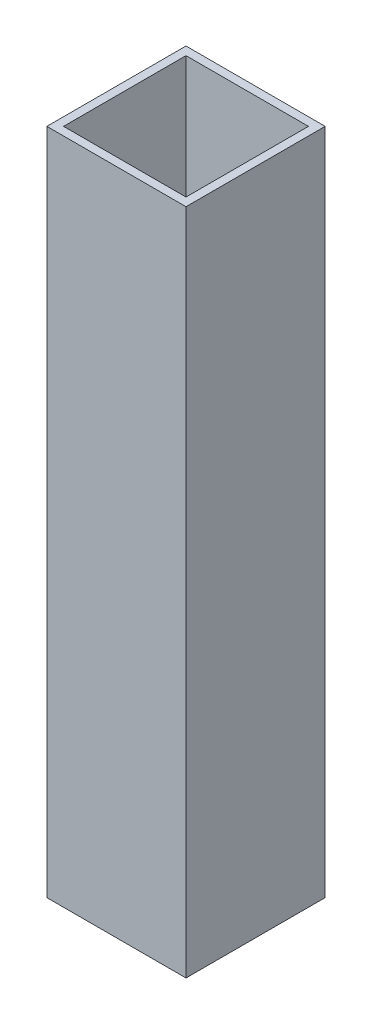
ISO-10303-21;
HEADER;
FILE_DESCRIPTION(('STEP AP214'),'2;1');
FILE_NAME('part.step','',(''),(''),'','','');
FILE_SCHEMA(('AUTOMOTIVE_DESIGN { 1 0 10303 214 1 1 1 1 }'));
ENDSEC;
DATA;
#1=APPLICATION_CONTEXT('core data for automotive mechanical design processes');
#2=APPLICATION_PROTOCOL_DEFINITION('international standard','automotive_design',2000,#1);
#3=PRODUCT_CONTEXT('',#1,'mechanical');
#4=PRODUCT('Part','Part','',(#3));
#5=PRODUCT_RELATED_PRODUCT_CATEGORY('part','',(#4));
#6=PRODUCT_DEFINITION_FORMATION('','',#4);
#7=PRODUCT_DEFINITION_CONTEXT('part definition',#1,'design');
#8=PRODUCT_DEFINITION('design','',#6,#7);
#9=PRODUCT_DEFINITION_SHAPE('','',#8);
#10=(LENGTH_UNIT() NAMED_UNIT(*) SI_UNIT(.MILLI.,.METRE.));
#11=(NAMED_UNIT(*) PLANE_ANGLE_UNIT() SI_UNIT($,.RADIAN.));
#12=(NAMED_UNIT(*) SI_UNIT($,.STERADIAN.) SOLID_ANGLE_UNIT());
#13=UNCERTAINTY_MEASURE_WITH_UNIT(LENGTH_MEASURE(1.E-05),#10,'distance_accuracy_value','');
#14=(GEOMETRIC_REPRESENTATION_CONTEXT(3) GLOBAL_UNCERTAINTY_ASSIGNED_CONTEXT((#13)) GLOBAL_UNIT_ASSIGNED_CONTEXT((#10,
#11,#12)) REPRESENTATION_CONTEXT('',''));
#15=CARTESIAN_POINT('',(0.,0.,0.));
#16=DIRECTION('',(0.,0.,1.));
#17=DIRECTION('',(1.,0.,0.));
#18=AXIS2_PLACEMENT_3D('',#15,#16,#17);
#19=CARTESIAN_POINT('',(12.5,-60.,-12.5));
#20=DIRECTION('',(1.,0.,0.));
#21=DIRECTION('',(0.,0.,-1.));
#22=AXIS2_PLACEMENT_3D('',#19,#20,#21);
#23=PLANE('',#22);
#24=DIRECTION('',(0.,1.,0.));
#25=VECTOR('',#24,1.);
#26=CARTESIAN_POINT('',(12.5,-60.,-12.5));
#27=LINE('',#26,#25);
#28=CARTESIAN_POINT('',(12.5,-60.,-12.5));
#29=VERTEX_POINT('',#28);
#30=CARTESIAN_POINT('',(12.5,60.,-12.5));
#31=VERTEX_POINT('',#30);
#32=EDGE_CURVE('E40',#29,#31,#27,.T.);
#33=ORIENTED_EDGE('',*,*,#32,.T.);
#34=DIRECTION('',(0.,0.,-1.));
#35=VECTOR('',#34,1.);
#36=CARTESIAN_POINT('',(12.5,60.,-12.5));
#37=LINE('',#36,#35);
#38=CARTESIAN_POINT('',(12.5,60.,12.5));
#39=VERTEX_POINT('',#38);
#40=EDGE_CURVE('E132',#39,#31,#37,.T.);
#41=ORIENTED_EDGE('',*,*,#40,.F.);
#42=DIRECTION('',(0.,1.,0.));
#43=VECTOR('',#42,1.);
#44=CARTESIAN_POINT('',(12.5,-60.,12.5));
#45=LINE('',#44,#43);
#46=CARTESIAN_POINT('',(12.5,-60.,12.5));
#47=VERTEX_POINT('',#46);
#48=EDGE_CURVE('E11',#47,#39,#45,.T.);
#49=ORIENTED_EDGE('',*,*,#48,.F.);
#50=DIRECTION('',(0.,0.,-1.));
#51=VECTOR('',#50,1.);
#52=CARTESIAN_POINT('',(12.5,-60.,-12.5));
#53=LINE('',#52,#51);
#54=EDGE_CURVE('E151',#47,#29,#53,.T.);
#55=ORIENTED_EDGE('',*,*,#54,.T.);
#56=EDGE_LOOP('',(#33,#41,#49,#55));
#57=FACE_BOUND('',#56,.T.);
#58=ADVANCED_FACE('F37',(#57),#23,.T.);
#59=CARTESIAN_POINT('',(-12.5,-60.,12.5));
#60=DIRECTION('',(0.,0.,1.));
#61=DIRECTION('',(1.,0.,0.));
#62=AXIS2_PLACEMENT_3D('',#59,#60,#61);
#63=PLANE('',#62);
#64=ORIENTED_EDGE('',*,*,#48,.T.);
#65=DIRECTION('',(1.,0.,0.));
#66=VECTOR('',#65,1.);
#67=CARTESIAN_POINT('',(-12.5,60.,12.5));
#68=LINE('',#67,#66);
#69=CARTESIAN_POINT('',(-12.5,60.,12.5));
#70=VERTEX_POINT('',#69);
#71=EDGE_CURVE('E141',#70,#39,#68,.T.);
#72=ORIENTED_EDGE('',*,*,#71,.F.);
#73=DIRECTION('',(0.,1.,0.));
#74=VECTOR('',#73,1.);
#75=CARTESIAN_POINT('',(-12.5,-60.,12.5));
#76=LINE('',#75,#74);
#77=CARTESIAN_POINT('',(-12.5,-60.,12.5));
#78=VERTEX_POINT('',#77);
#79=EDGE_CURVE('E45',#78,#70,#76,.T.);
#80=ORIENTED_EDGE('',*,*,#79,.F.);
#81=DIRECTION('',(1.,0.,0.));
#82=VECTOR('',#81,1.);
#83=CARTESIAN_POINT('',(-12.5,-60.,12.5));
#84=LINE('',#83,#82);
#85=EDGE_CURVE('E162',#78,#47,#84,.T.);
#86=ORIENTED_EDGE('',*,*,#85,.T.);
#87=EDGE_LOOP('',(#64,#72,#80,#86));
#88=FACE_BOUND('',#87,.T.);
#89=ADVANCED_FACE('F174',(#88),#63,.T.);
#90=CARTESIAN_POINT('',(-12.5,-60.,-12.5));
#91=DIRECTION('',(-1.,0.,0.));
#92=DIRECTION('',(0.,0.,1.));
#93=AXIS2_PLACEMENT_3D('',#90,#91,#92);
#94=PLANE('',#93);
#95=ORIENTED_EDGE('',*,*,#79,.T.);
#96=DIRECTION('',(0.,0.,1.));
#97=VECTOR('',#96,1.);
#98=CARTESIAN_POINT('',(-12.5,60.,-12.5));
#99=LINE('',#98,#97);
#100=CARTESIAN_POINT('',(-12.5,60.,-12.5));
#101=VERTEX_POINT('',#100);
#102=EDGE_CURVE('E138',#101,#70,#99,.T.);
#103=ORIENTED_EDGE('',*,*,#102,.F.);
#104=DIRECTION('',(0.,1.,0.));
#105=VECTOR('',#104,1.);
#106=CARTESIAN_POINT('',(-12.5,-60.,-12.5));
#107=LINE('',#106,#105);
#108=CARTESIAN_POINT('',(-12.5,-60.,-12.5));
#109=VERTEX_POINT('',#108);
#110=EDGE_CURVE('E165',#109,#101,#107,.T.);
#111=ORIENTED_EDGE('',*,*,#110,.F.);
#112=DIRECTION('',(0.,0.,1.));
#113=VECTOR('',#112,1.);
#114=CARTESIAN_POINT('',(-12.5,-60.,-12.5));
#115=LINE('',#114,#113);
#116=EDGE_CURVE('E159',#109,#78,#115,.T.);
#117=ORIENTED_EDGE('',*,*,#116,.T.);
#118=EDGE_LOOP('',(#95,#103,#111,#117));
#119=FACE_BOUND('',#118,.T.);
#120=ADVANCED_FACE('F180',(#119),#94,.T.);
#121=CARTESIAN_POINT('',(-12.5,-60.,-12.5));
#122=DIRECTION('',(0.,0.,-1.));
#123=DIRECTION('',(-1.,0.,0.));
#124=AXIS2_PLACEMENT_3D('',#121,#122,#123);
#125=PLANE('',#124);
#126=ORIENTED_EDGE('',*,*,#110,.T.);
#127=DIRECTION('',(-1.,0.,0.));
#128=VECTOR('',#127,1.);
#129=CARTESIAN_POINT('',(-12.5,60.,-12.5));
#130=LINE('',#129,#128);
#131=EDGE_CURVE('E135',#31,#101,#130,.T.);
#132=ORIENTED_EDGE('',*,*,#131,.F.);
#133=ORIENTED_EDGE('',*,*,#32,.F.);
#134=DIRECTION('',(-1.,0.,0.));
#135=VECTOR('',#134,1.);
#136=CARTESIAN_POINT('',(-12.5,-60.,-12.5));
#137=LINE('',#136,#135);
#138=EDGE_CURVE('E156',#29,#109,#137,.T.);
#139=ORIENTED_EDGE('',*,*,#138,.T.);
#140=EDGE_LOOP('',(#126,#132,#133,#139));
#141=FACE_BOUND('',#140,.T.);
#142=ADVANCED_FACE('F169',(#141),#125,.T.);
#143=CARTESIAN_POINT('',(0.,-60.,0.));
#144=DIRECTION('',(0.,1.,0.));
#145=DIRECTION('',(0.,0.,1.));
#146=AXIS2_PLACEMENT_3D('',#143,#144,#145);
#147=PLANE('',#146);
#148=DIRECTION('',(0.,0.,-1.));
#149=VECTOR('',#148,1.);
#150=CARTESIAN_POINT('',(11.,-60.,-11.));
#151=LINE('',#150,#149);
#152=CARTESIAN_POINT('',(11.,-60.,11.));
#153=VERTEX_POINT('',#152);
#154=CARTESIAN_POINT('',(11.,-60.,-11.));
#155=VERTEX_POINT('',#154);
#156=EDGE_CURVE('E114',#153,#155,#151,.T.);
#157=ORIENTED_EDGE('',*,*,#156,.T.);
#158=DIRECTION('',(-1.,0.,0.));
#159=VECTOR('',#158,1.);
#160=CARTESIAN_POINT('',(-11.,-60.,-11.));
#161=LINE('',#160,#159);
#162=CARTESIAN_POINT('',(-11.,-60.,-11.));
#163=VERTEX_POINT('',#162);
#164=EDGE_CURVE('E144',#155,#163,#161,.T.);
#165=ORIENTED_EDGE('',*,*,#164,.T.);
#166=DIRECTION('',(0.,0.,1.));
#167=VECTOR('',#166,1.);
#168=CARTESIAN_POINT('',(-11.,-60.,-11.));
#169=LINE('',#168,#167);
#170=CARTESIAN_POINT('',(-11.,-60.,11.));
#171=VERTEX_POINT('',#170);
#172=EDGE_CURVE('E109',#163,#171,#169,.T.);
#173=ORIENTED_EDGE('',*,*,#172,.T.);
#174=DIRECTION('',(1.,0.,0.));
#175=VECTOR('',#174,1.);
#176=CARTESIAN_POINT('',(-11.,-60.,11.));
#177=LINE('',#176,#175);
#178=EDGE_CURVE('E53',#171,#153,#177,.T.);
#179=ORIENTED_EDGE('',*,*,#178,.T.);
#180=EDGE_LOOP('',(#157,#165,#173,#179));
#181=FACE_BOUND('',#180,.T.);
#182=ORIENTED_EDGE('',*,*,#54,.F.);
#183=ORIENTED_EDGE('',*,*,#85,.F.);
#184=ORIENTED_EDGE('',*,*,#116,.F.);
#185=ORIENTED_EDGE('',*,*,#138,.F.);
#186=EDGE_LOOP('',(#182,#183,#184,#185));
#187=FACE_BOUND('',#186,.T.);
#188=ADVANCED_FACE('F178',(#181,#187),#147,.F.);
#189=CARTESIAN_POINT('',(-11.,-60.,-11.));
#190=DIRECTION('',(0.,0.,-1.));
#191=DIRECTION('',(-1.,0.,0.));
#192=AXIS2_PLACEMENT_3D('',#189,#190,#191);
#193=PLANE('',#192);
#194=DIRECTION('',(0.,1.,0.));
#195=VECTOR('',#194,1.);
#196=CARTESIAN_POINT('',(11.,-60.,-11.));
#197=LINE('',#196,#195);
#198=CARTESIAN_POINT('',(11.,60.,-11.));
#199=VERTEX_POINT('',#198);
#200=EDGE_CURVE('E119',#155,#199,#197,.T.);
#201=ORIENTED_EDGE('',*,*,#200,.T.);
#202=DIRECTION('',(-1.,0.,0.));
#203=VECTOR('',#202,1.);
#204=CARTESIAN_POINT('',(-11.,60.,-11.));
#205=LINE('',#204,#203);
#206=CARTESIAN_POINT('',(-11.,60.,-11.));
#207=VERTEX_POINT('',#206);
#208=EDGE_CURVE('E117',#199,#207,#205,.T.);
#209=ORIENTED_EDGE('',*,*,#208,.T.);
#210=DIRECTION('',(0.,1.,0.));
#211=VECTOR('',#210,1.);
#212=CARTESIAN_POINT('',(-11.,-60.,-11.));
#213=LINE('',#212,#211);
#214=EDGE_CURVE('E102',#163,#207,#213,.T.);
#215=ORIENTED_EDGE('',*,*,#214,.F.);
#216=ORIENTED_EDGE('',*,*,#164,.F.);
#217=EDGE_LOOP('',(#201,#209,#215,#216));
#218=FACE_BOUND('',#217,.T.);
#219=ADVANCED_FACE('F118',(#218),#193,.F.);
#220=CARTESIAN_POINT('',(11.,-60.,-11.));
#221=DIRECTION('',(1.,0.,0.));
#222=DIRECTION('',(0.,0.,-1.));
#223=AXIS2_PLACEMENT_3D('',#220,#221,#222);
#224=PLANE('',#223);
#225=DIRECTION('',(0.,1.,0.));
#226=VECTOR('',#225,1.);
#227=CARTESIAN_POINT('',(11.,-60.,11.));
#228=LINE('',#227,#226);
#229=CARTESIAN_POINT('',(11.,60.,11.));
#230=VERTEX_POINT('',#229);
#231=EDGE_CURVE('E152',#153,#230,#228,.T.);
#232=ORIENTED_EDGE('',*,*,#231,.T.);
#233=DIRECTION('',(0.,0.,-1.));
#234=VECTOR('',#233,1.);
#235=CARTESIAN_POINT('',(11.,60.,-11.));
#236=LINE('',#235,#234);
#237=EDGE_CURVE('E128',#230,#199,#236,.T.);
#238=ORIENTED_EDGE('',*,*,#237,.T.);
#239=ORIENTED_EDGE('',*,*,#200,.F.);
#240=ORIENTED_EDGE('',*,*,#156,.F.);
#241=EDGE_LOOP('',(#232,#238,#239,#240));
#242=FACE_BOUND('',#241,.T.);
#243=ADVANCED_FACE('F223',(#242),#224,.F.);
#244=CARTESIAN_POINT('',(-11.,-60.,11.));
#245=DIRECTION('',(0.,0.,1.));
#246=DIRECTION('',(1.,0.,0.));
#247=AXIS2_PLACEMENT_3D('',#244,#245,#246);
#248=PLANE('',#247);
#249=DIRECTION('',(0.,1.,0.));
#250=VECTOR('',#249,1.);
#251=CARTESIAN_POINT('',(-11.,-60.,11.));
#252=LINE('',#251,#250);
#253=CARTESIAN_POINT('',(-11.,60.,11.));
#254=VERTEX_POINT('',#253);
#255=EDGE_CURVE('E113',#171,#254,#252,.T.);
#256=ORIENTED_EDGE('',*,*,#255,.T.);
#257=DIRECTION('',(1.,0.,0.));
#258=VECTOR('',#257,1.);
#259=CARTESIAN_POINT('',(-11.,60.,11.));
#260=LINE('',#259,#258);
#261=EDGE_CURVE('E126',#254,#230,#260,.T.);
#262=ORIENTED_EDGE('',*,*,#261,.T.);
#263=ORIENTED_EDGE('',*,*,#231,.F.);
#264=ORIENTED_EDGE('',*,*,#178,.F.);
#265=EDGE_LOOP('',(#256,#262,#263,#264));
#266=FACE_BOUND('',#265,.T.);
#267=ADVANCED_FACE('F232',(#266),#248,.F.);
#268=CARTESIAN_POINT('',(-11.,-60.,-11.));
#269=DIRECTION('',(-1.,0.,0.));
#270=DIRECTION('',(0.,0.,1.));
#271=AXIS2_PLACEMENT_3D('',#268,#269,#270);
#272=PLANE('',#271);
#273=ORIENTED_EDGE('',*,*,#214,.T.);
#274=DIRECTION('',(0.,0.,1.));
#275=VECTOR('',#274,1.);
#276=CARTESIAN_POINT('',(-11.,60.,-11.));
#277=LINE('',#276,#275);
#278=EDGE_CURVE('E106',#207,#254,#277,.T.);
#279=ORIENTED_EDGE('',*,*,#278,.T.);
#280=ORIENTED_EDGE('',*,*,#255,.F.);
#281=ORIENTED_EDGE('',*,*,#172,.F.);
#282=EDGE_LOOP('',(#273,#279,#280,#281));
#283=FACE_BOUND('',#282,.T.);
#284=ADVANCED_FACE('F104',(#283),#272,.F.);
#285=CARTESIAN_POINT('',(0.,60.,0.));
#286=DIRECTION('',(0.,1.,0.));
#287=DIRECTION('',(0.,0.,1.));
#288=AXIS2_PLACEMENT_3D('',#285,#286,#287);
#289=PLANE('',#288);
#290=ORIENTED_EDGE('',*,*,#40,.T.);
#291=ORIENTED_EDGE('',*,*,#131,.T.);
#292=ORIENTED_EDGE('',*,*,#102,.T.);
#293=ORIENTED_EDGE('',*,*,#71,.T.);
#294=EDGE_LOOP('',(#290,#291,#292,#293));
#295=FACE_BOUND('',#294,.T.);
#296=ORIENTED_EDGE('',*,*,#278,.F.);
#297=ORIENTED_EDGE('',*,*,#208,.F.);
#298=ORIENTED_EDGE('',*,*,#237,.F.);
#299=ORIENTED_EDGE('',*,*,#261,.F.);
#300=EDGE_LOOP('',(#296,#297,#298,#299));
#301=FACE_BOUND('',#300,.T.);
#302=ADVANCED_FACE('F124',(#295,#301),#289,.T.);
#303=CLOSED_SHELL('',(#58,#89,#120,#142,#188,#219,#243,#267,#284,#302));
#304=MANIFOLD_SOLID_BREP('B2',#303);
#305=ADVANCED_BREP_SHAPE_REPRESENTATION('',(#18,#304),#14);
#306=SHAPE_DEFINITION_REPRESENTATION(#9,#305);
ENDSEC;
END-ISO-10303-21;
